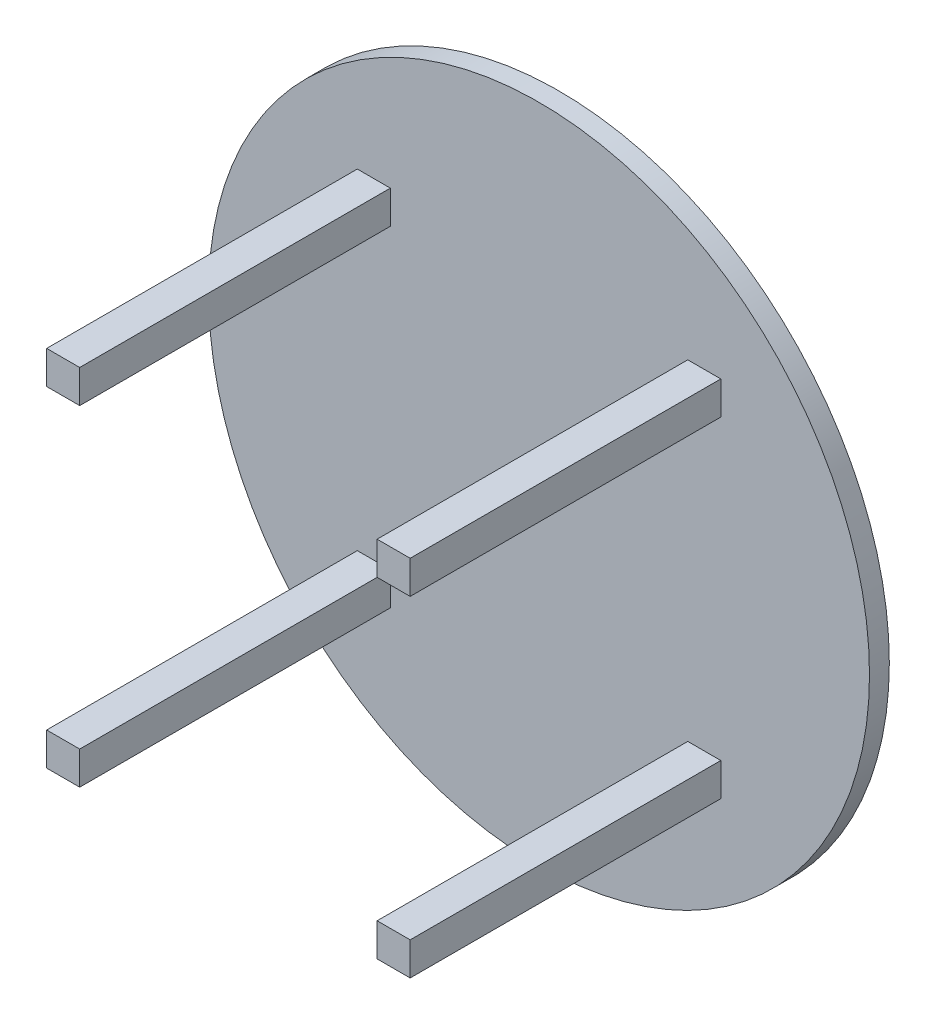
ISO-10303-21;
HEADER;
FILE_DESCRIPTION(('STEP AP214'),'2;1');
FILE_NAME('part.step','',(''),(''),'','','');
FILE_SCHEMA(('AUTOMOTIVE_DESIGN { 1 0 10303 214 1 1 1 1 }'));
ENDSEC;
DATA;
#1=APPLICATION_CONTEXT('core data for automotive mechanical design processes');
#2=APPLICATION_PROTOCOL_DEFINITION('international standard','automotive_design',2000,#1);
#3=PRODUCT_CONTEXT('',#1,'mechanical');
#4=PRODUCT('Part','Part','',(#3));
#5=PRODUCT_RELATED_PRODUCT_CATEGORY('part','',(#4));
#6=PRODUCT_DEFINITION_FORMATION('','',#4);
#7=PRODUCT_DEFINITION_CONTEXT('part definition',#1,'design');
#8=PRODUCT_DEFINITION('design','',#6,#7);
#9=PRODUCT_DEFINITION_SHAPE('','',#8);
#10=(LENGTH_UNIT() NAMED_UNIT(*) SI_UNIT(.MILLI.,.METRE.));
#11=(NAMED_UNIT(*) PLANE_ANGLE_UNIT() SI_UNIT($,.RADIAN.));
#12=(NAMED_UNIT(*) SI_UNIT($,.STERADIAN.) SOLID_ANGLE_UNIT());
#13=UNCERTAINTY_MEASURE_WITH_UNIT(LENGTH_MEASURE(1.E-05),#10,'distance_accuracy_value','');
#14=(GEOMETRIC_REPRESENTATION_CONTEXT(3) GLOBAL_UNCERTAINTY_ASSIGNED_CONTEXT((#13)) GLOBAL_UNIT_ASSIGNED_CONTEXT((#10,
#11,#12)) REPRESENTATION_CONTEXT('',''));
#15=CARTESIAN_POINT('',(0.,0.,0.));
#16=DIRECTION('',(0.,0.,1.));
#17=DIRECTION('',(1.,0.,0.));
#18=AXIS2_PLACEMENT_3D('',#15,#16,#17);
#19=CARTESIAN_POINT('',(0.,0.,30.));
#20=DIRECTION('',(0.,0.,1.));
#21=DIRECTION('',(1.,0.,0.));
#22=AXIS2_PLACEMENT_3D('',#19,#20,#21);
#23=PLANE('',#22);
#24=CARTESIAN_POINT('',(0.,0.,30.));
#25=DIRECTION('',(0.,0.,1.));
#26=DIRECTION('',(1.,0.,0.));
#27=AXIS2_PLACEMENT_3D('',#24,#25,#26);
#28=CIRCLE('',#27,500.);
#29=CARTESIAN_POINT('',(500.,0.,30.));
#30=VERTEX_POINT('',#29);
#31=EDGE_CURVE('E11',#30,#30,#28,.T.);
#32=ORIENTED_EDGE('',*,*,#31,.T.);
#33=EDGE_LOOP('',(#32));
#34=FACE_BOUND('',#33,.T.);
#35=DIRECTION('',(1.,0.,0.));
#36=VECTOR('',#35,1.);
#37=CARTESIAN_POINT('',(0.,275.,30.));
#38=LINE('',#37,#36);
#39=CARTESIAN_POINT('',(225.,275.,30.));
#40=VERTEX_POINT('',#39);
#41=CARTESIAN_POINT('',(275.,275.,30.));
#42=VERTEX_POINT('',#41);
#43=EDGE_CURVE('E280',#40,#42,#38,.T.);
#44=ORIENTED_EDGE('',*,*,#43,.T.);
#45=DIRECTION('',(0.,-1.,0.));
#46=VECTOR('',#45,1.);
#47=CARTESIAN_POINT('',(275.,0.,30.));
#48=LINE('',#47,#46);
#49=CARTESIAN_POINT('',(275.,225.,30.));
#50=VERTEX_POINT('',#49);
#51=EDGE_CURVE('E283',#42,#50,#48,.T.);
#52=ORIENTED_EDGE('',*,*,#51,.T.);
#53=DIRECTION('',(-1.,0.,0.));
#54=VECTOR('',#53,1.);
#55=CARTESIAN_POINT('',(0.,225.,30.));
#56=LINE('',#55,#54);
#57=CARTESIAN_POINT('',(225.,225.,30.));
#58=VERTEX_POINT('',#57);
#59=EDGE_CURVE('E274',#50,#58,#56,.T.);
#60=ORIENTED_EDGE('',*,*,#59,.T.);
#61=DIRECTION('',(0.,1.,0.));
#62=VECTOR('',#61,1.);
#63=CARTESIAN_POINT('',(225.,0.,30.));
#64=LINE('',#63,#62);
#65=EDGE_CURVE('E277',#58,#40,#64,.T.);
#66=ORIENTED_EDGE('',*,*,#65,.T.);
#67=EDGE_LOOP('',(#44,#52,#60,#66));
#68=FACE_BOUND('',#67,.T.);
#69=DIRECTION('',(1.,0.,0.));
#70=VECTOR('',#69,1.);
#71=CARTESIAN_POINT('',(0.,-225.,30.));
#72=LINE('',#71,#70);
#73=CARTESIAN_POINT('',(225.,-225.,30.));
#74=VERTEX_POINT('',#73);
#75=CARTESIAN_POINT('',(275.,-225.,30.));
#76=VERTEX_POINT('',#75);
#77=EDGE_CURVE('E248',#74,#76,#72,.T.);
#78=ORIENTED_EDGE('',*,*,#77,.T.);
#79=DIRECTION('',(0.,-1.,0.));
#80=VECTOR('',#79,1.);
#81=CARTESIAN_POINT('',(275.,0.,30.));
#82=LINE('',#81,#80);
#83=CARTESIAN_POINT('',(275.,-275.,30.));
#84=VERTEX_POINT('',#83);
#85=EDGE_CURVE('E251',#76,#84,#82,.T.);
#86=ORIENTED_EDGE('',*,*,#85,.T.);
#87=DIRECTION('',(-1.,0.,0.));
#88=VECTOR('',#87,1.);
#89=CARTESIAN_POINT('',(0.,-275.,30.));
#90=LINE('',#89,#88);
#91=CARTESIAN_POINT('',(225.,-275.,30.));
#92=VERTEX_POINT('',#91);
#93=EDGE_CURVE('E242',#84,#92,#90,.T.);
#94=ORIENTED_EDGE('',*,*,#93,.T.);
#95=DIRECTION('',(0.,1.,0.));
#96=VECTOR('',#95,1.);
#97=CARTESIAN_POINT('',(225.,0.,30.));
#98=LINE('',#97,#96);
#99=EDGE_CURVE('E245',#92,#74,#98,.T.);
#100=ORIENTED_EDGE('',*,*,#99,.T.);
#101=EDGE_LOOP('',(#78,#86,#94,#100));
#102=FACE_BOUND('',#101,.T.);
#103=DIRECTION('',(1.,0.,0.));
#104=VECTOR('',#103,1.);
#105=CARTESIAN_POINT('',(0.,275.,30.));
#106=LINE('',#105,#104);
#107=CARTESIAN_POINT('',(-275.,275.,30.));
#108=VERTEX_POINT('',#107);
#109=CARTESIAN_POINT('',(-225.,275.,30.));
#110=VERTEX_POINT('',#109);
#111=EDGE_CURVE('E216',#108,#110,#106,.T.);
#112=ORIENTED_EDGE('',*,*,#111,.T.);
#113=DIRECTION('',(0.,-1.,0.));
#114=VECTOR('',#113,1.);
#115=CARTESIAN_POINT('',(-225.,0.,30.));
#116=LINE('',#115,#114);
#117=CARTESIAN_POINT('',(-225.,225.,30.));
#118=VERTEX_POINT('',#117);
#119=EDGE_CURVE('E219',#110,#118,#116,.T.);
#120=ORIENTED_EDGE('',*,*,#119,.T.);
#121=DIRECTION('',(-1.,0.,0.));
#122=VECTOR('',#121,1.);
#123=CARTESIAN_POINT('',(0.,225.,30.));
#124=LINE('',#123,#122);
#125=CARTESIAN_POINT('',(-275.,225.,30.));
#126=VERTEX_POINT('',#125);
#127=EDGE_CURVE('E210',#118,#126,#124,.T.);
#128=ORIENTED_EDGE('',*,*,#127,.T.);
#129=DIRECTION('',(0.,1.,0.));
#130=VECTOR('',#129,1.);
#131=CARTESIAN_POINT('',(-275.,0.,30.));
#132=LINE('',#131,#130);
#133=EDGE_CURVE('E213',#126,#108,#132,.T.);
#134=ORIENTED_EDGE('',*,*,#133,.T.);
#135=EDGE_LOOP('',(#112,#120,#128,#134));
#136=FACE_BOUND('',#135,.T.);
#137=DIRECTION('',(1.,0.,0.));
#138=VECTOR('',#137,1.);
#139=CARTESIAN_POINT('',(0.,-225.,30.));
#140=LINE('',#139,#138);
#141=CARTESIAN_POINT('',(-275.,-225.,30.));
#142=VERTEX_POINT('',#141);
#143=CARTESIAN_POINT('',(-225.,-225.,30.));
#144=VERTEX_POINT('',#143);
#145=EDGE_CURVE('E188',#142,#144,#140,.T.);
#146=ORIENTED_EDGE('',*,*,#145,.T.);
#147=DIRECTION('',(0.,-1.,0.));
#148=VECTOR('',#147,1.);
#149=CARTESIAN_POINT('',(-225.,0.,30.));
#150=LINE('',#149,#148);
#151=CARTESIAN_POINT('',(-225.,-275.,30.));
#152=VERTEX_POINT('',#151);
#153=EDGE_CURVE('E177',#144,#152,#150,.T.);
#154=ORIENTED_EDGE('',*,*,#153,.T.);
#155=DIRECTION('',(-1.,0.,0.));
#156=VECTOR('',#155,1.);
#157=CARTESIAN_POINT('',(0.,-275.,30.));
#158=LINE('',#157,#156);
#159=CARTESIAN_POINT('',(-275.,-275.,30.));
#160=VERTEX_POINT('',#159);
#161=EDGE_CURVE('E178',#152,#160,#158,.T.);
#162=ORIENTED_EDGE('',*,*,#161,.T.);
#163=DIRECTION('',(0.,1.,0.));
#164=VECTOR('',#163,1.);
#165=CARTESIAN_POINT('',(-275.,0.,30.));
#166=LINE('',#165,#164);
#167=EDGE_CURVE('E181',#160,#142,#166,.T.);
#168=ORIENTED_EDGE('',*,*,#167,.T.);
#169=EDGE_LOOP('',(#146,#154,#162,#168));
#170=FACE_BOUND('',#169,.T.);
#171=ADVANCED_FACE('F40',(#34,#68,#102,#136,#170),#23,.T.);
#172=CARTESIAN_POINT('',(0.,0.,30.));
#173=DIRECTION('',(0.,0.,-1.));
#174=DIRECTION('',(-1.,0.,0.));
#175=AXIS2_PLACEMENT_3D('',#172,#173,#174);
#176=CYLINDRICAL_SURFACE('',#175,500.);
#177=ORIENTED_EDGE('',*,*,#31,.F.);
#178=EDGE_LOOP('',(#177));
#179=FACE_BOUND('',#178,.T.);
#180=CARTESIAN_POINT('',(0.,0.,0.));
#181=DIRECTION('',(0.,0.,1.));
#182=DIRECTION('',(1.,0.,0.));
#183=AXIS2_PLACEMENT_3D('',#180,#181,#182);
#184=CIRCLE('',#183,500.);
#185=CARTESIAN_POINT('',(500.,0.,0.));
#186=VERTEX_POINT('',#185);
#187=EDGE_CURVE('E44',#186,#186,#184,.T.);
#188=ORIENTED_EDGE('',*,*,#187,.T.);
#189=EDGE_LOOP('',(#188));
#190=FACE_BOUND('',#189,.T.);
#191=ADVANCED_FACE('F42',(#179,#190),#176,.T.);
#192=CARTESIAN_POINT('',(0.,0.,0.));
#193=DIRECTION('',(0.,0.,1.));
#194=DIRECTION('',(1.,0.,0.));
#195=AXIS2_PLACEMENT_3D('',#192,#193,#194);
#196=PLANE('',#195);
#197=ORIENTED_EDGE('',*,*,#187,.F.);
#198=EDGE_LOOP('',(#197));
#199=FACE_BOUND('',#198,.T.);
#200=ADVANCED_FACE('F290',(#199),#196,.F.);
#201=CARTESIAN_POINT('',(275.,225.,500.));
#202=DIRECTION('',(-1.,0.,0.));
#203=DIRECTION('',(0.,0.,1.));
#204=AXIS2_PLACEMENT_3D('',#201,#202,#203);
#205=PLANE('',#204);
#206=ORIENTED_EDGE('',*,*,#51,.F.);
#207=DIRECTION('',(0.,0.,-1.));
#208=VECTOR('',#207,1.);
#209=CARTESIAN_POINT('',(275.,275.,500.));
#210=LINE('',#209,#208);
#211=CARTESIAN_POINT('',(275.,275.,500.));
#212=VERTEX_POINT('',#211);
#213=EDGE_CURVE('E271',#212,#42,#210,.T.);
#214=ORIENTED_EDGE('',*,*,#213,.F.);
#215=DIRECTION('',(0.,1.,0.));
#216=VECTOR('',#215,1.);
#217=CARTESIAN_POINT('',(275.,225.,500.));
#218=LINE('',#217,#216);
#219=CARTESIAN_POINT('',(275.,225.,500.));
#220=VERTEX_POINT('',#219);
#221=EDGE_CURVE('E254',#220,#212,#218,.T.);
#222=ORIENTED_EDGE('',*,*,#221,.F.);
#223=DIRECTION('',(0.,0.,-1.));
#224=VECTOR('',#223,1.);
#225=CARTESIAN_POINT('',(275.,225.,500.));
#226=LINE('',#225,#224);
#227=EDGE_CURVE('E263',#220,#50,#226,.T.);
#228=ORIENTED_EDGE('',*,*,#227,.T.);
#229=EDGE_LOOP('',(#206,#214,#222,#228));
#230=FACE_BOUND('',#229,.T.);
#231=ADVANCED_FACE('F292',(#230),#205,.F.);
#232=CARTESIAN_POINT('',(225.,275.,500.));
#233=DIRECTION('',(0.,-1.,0.));
#234=DIRECTION('',(0.,0.,-1.));
#235=AXIS2_PLACEMENT_3D('',#232,#233,#234);
#236=PLANE('',#235);
#237=ORIENTED_EDGE('',*,*,#43,.F.);
#238=DIRECTION('',(0.,0.,-1.));
#239=VECTOR('',#238,1.);
#240=CARTESIAN_POINT('',(225.,275.,500.));
#241=LINE('',#240,#239);
#242=CARTESIAN_POINT('',(225.,275.,500.));
#243=VERTEX_POINT('',#242);
#244=EDGE_CURVE('E268',#243,#40,#241,.T.);
#245=ORIENTED_EDGE('',*,*,#244,.F.);
#246=DIRECTION('',(-1.,0.,0.));
#247=VECTOR('',#246,1.);
#248=CARTESIAN_POINT('',(225.,275.,500.));
#249=LINE('',#248,#247);
#250=EDGE_CURVE('E257',#212,#243,#249,.T.);
#251=ORIENTED_EDGE('',*,*,#250,.F.);
#252=ORIENTED_EDGE('',*,*,#213,.T.);
#253=EDGE_LOOP('',(#237,#245,#251,#252));
#254=FACE_BOUND('',#253,.T.);
#255=ADVANCED_FACE('F298',(#254),#236,.F.);
#256=CARTESIAN_POINT('',(225.,225.,500.));
#257=DIRECTION('',(1.,0.,0.));
#258=DIRECTION('',(0.,0.,-1.));
#259=AXIS2_PLACEMENT_3D('',#256,#257,#258);
#260=PLANE('',#259);
#261=ORIENTED_EDGE('',*,*,#65,.F.);
#262=DIRECTION('',(0.,0.,-1.));
#263=VECTOR('',#262,1.);
#264=CARTESIAN_POINT('',(225.,225.,500.));
#265=LINE('',#264,#263);
#266=CARTESIAN_POINT('',(225.,225.,500.));
#267=VERTEX_POINT('',#266);
#268=EDGE_CURVE('E266',#267,#58,#265,.T.);
#269=ORIENTED_EDGE('',*,*,#268,.F.);
#270=DIRECTION('',(0.,-1.,0.));
#271=VECTOR('',#270,1.);
#272=CARTESIAN_POINT('',(225.,225.,500.));
#273=LINE('',#272,#271);
#274=EDGE_CURVE('E259',#243,#267,#273,.T.);
#275=ORIENTED_EDGE('',*,*,#274,.F.);
#276=ORIENTED_EDGE('',*,*,#244,.T.);
#277=EDGE_LOOP('',(#261,#269,#275,#276));
#278=FACE_BOUND('',#277,.T.);
#279=ADVANCED_FACE('F311',(#278),#260,.F.);
#280=CARTESIAN_POINT('',(225.,225.,500.));
#281=DIRECTION('',(0.,1.,0.));
#282=DIRECTION('',(0.,0.,1.));
#283=AXIS2_PLACEMENT_3D('',#280,#281,#282);
#284=PLANE('',#283);
#285=ORIENTED_EDGE('',*,*,#59,.F.);
#286=ORIENTED_EDGE('',*,*,#227,.F.);
#287=DIRECTION('',(1.,0.,0.));
#288=VECTOR('',#287,1.);
#289=CARTESIAN_POINT('',(225.,225.,500.));
#290=LINE('',#289,#288);
#291=EDGE_CURVE('E261',#267,#220,#290,.T.);
#292=ORIENTED_EDGE('',*,*,#291,.F.);
#293=ORIENTED_EDGE('',*,*,#268,.T.);
#294=EDGE_LOOP('',(#285,#286,#292,#293));
#295=FACE_BOUND('',#294,.T.);
#296=ADVANCED_FACE('F315',(#295),#284,.F.);
#297=CARTESIAN_POINT('',(0.,0.,500.));
#298=DIRECTION('',(0.,0.,-1.));
#299=DIRECTION('',(-1.,0.,0.));
#300=AXIS2_PLACEMENT_3D('',#297,#298,#299);
#301=PLANE('',#300);
#302=ORIENTED_EDGE('',*,*,#221,.T.);
#303=ORIENTED_EDGE('',*,*,#250,.T.);
#304=ORIENTED_EDGE('',*,*,#274,.T.);
#305=ORIENTED_EDGE('',*,*,#291,.T.);
#306=EDGE_LOOP('',(#302,#303,#304,#305));
#307=FACE_BOUND('',#306,.T.);
#308=ADVANCED_FACE('F319',(#307),#301,.F.);
#309=CARTESIAN_POINT('',(275.,-275.,500.));
#310=DIRECTION('',(-1.,0.,0.));
#311=DIRECTION('',(0.,0.,1.));
#312=AXIS2_PLACEMENT_3D('',#309,#310,#311);
#313=PLANE('',#312);
#314=ORIENTED_EDGE('',*,*,#85,.F.);
#315=DIRECTION('',(0.,0.,-1.));
#316=VECTOR('',#315,1.);
#317=CARTESIAN_POINT('',(275.,-225.,500.));
#318=LINE('',#317,#316);
#319=CARTESIAN_POINT('',(275.,-225.,500.));
#320=VERTEX_POINT('',#319);
#321=EDGE_CURVE('E239',#320,#76,#318,.T.);
#322=ORIENTED_EDGE('',*,*,#321,.F.);
#323=DIRECTION('',(0.,1.,0.));
#324=VECTOR('',#323,1.);
#325=CARTESIAN_POINT('',(275.,-275.,500.));
#326=LINE('',#325,#324);
#327=CARTESIAN_POINT('',(275.,-275.,500.));
#328=VERTEX_POINT('',#327);
#329=EDGE_CURVE('E222',#328,#320,#326,.T.);
#330=ORIENTED_EDGE('',*,*,#329,.F.);
#331=DIRECTION('',(0.,0.,-1.));
#332=VECTOR('',#331,1.);
#333=CARTESIAN_POINT('',(275.,-275.,500.));
#334=LINE('',#333,#332);
#335=EDGE_CURVE('E231',#328,#84,#334,.T.);
#336=ORIENTED_EDGE('',*,*,#335,.T.);
#337=EDGE_LOOP('',(#314,#322,#330,#336));
#338=FACE_BOUND('',#337,.T.);
#339=ADVANCED_FACE('F323',(#338),#313,.F.);
#340=CARTESIAN_POINT('',(225.,-225.,500.));
#341=DIRECTION('',(0.,-1.,0.));
#342=DIRECTION('',(0.,0.,-1.));
#343=AXIS2_PLACEMENT_3D('',#340,#341,#342);
#344=PLANE('',#343);
#345=ORIENTED_EDGE('',*,*,#77,.F.);
#346=DIRECTION('',(0.,0.,-1.));
#347=VECTOR('',#346,1.);
#348=CARTESIAN_POINT('',(225.,-225.,500.));
#349=LINE('',#348,#347);
#350=CARTESIAN_POINT('',(225.,-225.,500.));
#351=VERTEX_POINT('',#350);
#352=EDGE_CURVE('E236',#351,#74,#349,.T.);
#353=ORIENTED_EDGE('',*,*,#352,.F.);
#354=DIRECTION('',(-1.,0.,0.));
#355=VECTOR('',#354,1.);
#356=CARTESIAN_POINT('',(225.,-225.,500.));
#357=LINE('',#356,#355);
#358=EDGE_CURVE('E225',#320,#351,#357,.T.);
#359=ORIENTED_EDGE('',*,*,#358,.F.);
#360=ORIENTED_EDGE('',*,*,#321,.T.);
#361=EDGE_LOOP('',(#345,#353,#359,#360));
#362=FACE_BOUND('',#361,.T.);
#363=ADVANCED_FACE('F327',(#362),#344,.F.);
#364=CARTESIAN_POINT('',(225.,-275.,500.));
#365=DIRECTION('',(1.,0.,0.));
#366=DIRECTION('',(0.,0.,-1.));
#367=AXIS2_PLACEMENT_3D('',#364,#365,#366);
#368=PLANE('',#367);
#369=ORIENTED_EDGE('',*,*,#99,.F.);
#370=DIRECTION('',(0.,0.,-1.));
#371=VECTOR('',#370,1.);
#372=CARTESIAN_POINT('',(225.,-275.,500.));
#373=LINE('',#372,#371);
#374=CARTESIAN_POINT('',(225.,-275.,500.));
#375=VERTEX_POINT('',#374);
#376=EDGE_CURVE('E234',#375,#92,#373,.T.);
#377=ORIENTED_EDGE('',*,*,#376,.F.);
#378=DIRECTION('',(0.,-1.,0.));
#379=VECTOR('',#378,1.);
#380=CARTESIAN_POINT('',(225.,-275.,500.));
#381=LINE('',#380,#379);
#382=EDGE_CURVE('E227',#351,#375,#381,.T.);
#383=ORIENTED_EDGE('',*,*,#382,.F.);
#384=ORIENTED_EDGE('',*,*,#352,.T.);
#385=EDGE_LOOP('',(#369,#377,#383,#384));
#386=FACE_BOUND('',#385,.T.);
#387=ADVANCED_FACE('F331',(#386),#368,.F.);
#388=CARTESIAN_POINT('',(225.,-275.,500.));
#389=DIRECTION('',(0.,1.,0.));
#390=DIRECTION('',(0.,0.,1.));
#391=AXIS2_PLACEMENT_3D('',#388,#389,#390);
#392=PLANE('',#391);
#393=ORIENTED_EDGE('',*,*,#93,.F.);
#394=ORIENTED_EDGE('',*,*,#335,.F.);
#395=DIRECTION('',(1.,0.,0.));
#396=VECTOR('',#395,1.);
#397=CARTESIAN_POINT('',(225.,-275.,500.));
#398=LINE('',#397,#396);
#399=EDGE_CURVE('E229',#375,#328,#398,.T.);
#400=ORIENTED_EDGE('',*,*,#399,.F.);
#401=ORIENTED_EDGE('',*,*,#376,.T.);
#402=EDGE_LOOP('',(#393,#394,#400,#401));
#403=FACE_BOUND('',#402,.T.);
#404=ADVANCED_FACE('F335',(#403),#392,.F.);
#405=CARTESIAN_POINT('',(0.,0.,500.));
#406=DIRECTION('',(0.,0.,-1.));
#407=DIRECTION('',(-1.,0.,0.));
#408=AXIS2_PLACEMENT_3D('',#405,#406,#407);
#409=PLANE('',#408);
#410=ORIENTED_EDGE('',*,*,#329,.T.);
#411=ORIENTED_EDGE('',*,*,#358,.T.);
#412=ORIENTED_EDGE('',*,*,#382,.T.);
#413=ORIENTED_EDGE('',*,*,#399,.T.);
#414=EDGE_LOOP('',(#410,#411,#412,#413));
#415=FACE_BOUND('',#414,.T.);
#416=ADVANCED_FACE('F339',(#415),#409,.F.);
#417=CARTESIAN_POINT('',(-225.,225.,500.));
#418=DIRECTION('',(-1.,0.,0.));
#419=DIRECTION('',(0.,0.,1.));
#420=AXIS2_PLACEMENT_3D('',#417,#418,#419);
#421=PLANE('',#420);
#422=ORIENTED_EDGE('',*,*,#119,.F.);
#423=DIRECTION('',(0.,0.,-1.));
#424=VECTOR('',#423,1.);
#425=CARTESIAN_POINT('',(-225.,275.,500.));
#426=LINE('',#425,#424);
#427=CARTESIAN_POINT('',(-225.,275.,500.));
#428=VERTEX_POINT('',#427);
#429=EDGE_CURVE('E207',#428,#110,#426,.T.);
#430=ORIENTED_EDGE('',*,*,#429,.F.);
#431=DIRECTION('',(0.,1.,0.));
#432=VECTOR('',#431,1.);
#433=CARTESIAN_POINT('',(-225.,225.,500.));
#434=LINE('',#433,#432);
#435=CARTESIAN_POINT('',(-225.,225.,500.));
#436=VERTEX_POINT('',#435);
#437=EDGE_CURVE('E191',#436,#428,#434,.T.);
#438=ORIENTED_EDGE('',*,*,#437,.F.);
#439=DIRECTION('',(0.,0.,-1.));
#440=VECTOR('',#439,1.);
#441=CARTESIAN_POINT('',(-225.,225.,500.));
#442=LINE('',#441,#440);
#443=EDGE_CURVE('E200',#436,#118,#442,.T.);
#444=ORIENTED_EDGE('',*,*,#443,.T.);
#445=EDGE_LOOP('',(#422,#430,#438,#444));
#446=FACE_BOUND('',#445,.T.);
#447=ADVANCED_FACE('F343',(#446),#421,.F.);
#448=CARTESIAN_POINT('',(-275.,275.,500.));
#449=DIRECTION('',(0.,-1.,0.));
#450=DIRECTION('',(0.,0.,-1.));
#451=AXIS2_PLACEMENT_3D('',#448,#449,#450);
#452=PLANE('',#451);
#453=ORIENTED_EDGE('',*,*,#111,.F.);
#454=DIRECTION('',(0.,0.,-1.));
#455=VECTOR('',#454,1.);
#456=CARTESIAN_POINT('',(-275.,275.,500.));
#457=LINE('',#456,#455);
#458=CARTESIAN_POINT('',(-275.,275.,500.));
#459=VERTEX_POINT('',#458);
#460=EDGE_CURVE('E204',#459,#108,#457,.T.);
#461=ORIENTED_EDGE('',*,*,#460,.F.);
#462=DIRECTION('',(-1.,0.,0.));
#463=VECTOR('',#462,1.);
#464=CARTESIAN_POINT('',(-275.,275.,500.));
#465=LINE('',#464,#463);
#466=EDGE_CURVE('E194',#428,#459,#465,.T.);
#467=ORIENTED_EDGE('',*,*,#466,.F.);
#468=ORIENTED_EDGE('',*,*,#429,.T.);
#469=EDGE_LOOP('',(#453,#461,#467,#468));
#470=FACE_BOUND('',#469,.T.);
#471=ADVANCED_FACE('F347',(#470),#452,.F.);
#472=CARTESIAN_POINT('',(-275.,225.,500.));
#473=DIRECTION('',(1.,0.,0.));
#474=DIRECTION('',(0.,0.,-1.));
#475=AXIS2_PLACEMENT_3D('',#472,#473,#474);
#476=PLANE('',#475);
#477=ORIENTED_EDGE('',*,*,#133,.F.);
#478=DIRECTION('',(0.,0.,-1.));
#479=VECTOR('',#478,1.);
#480=CARTESIAN_POINT('',(-275.,225.,500.));
#481=LINE('',#480,#479);
#482=CARTESIAN_POINT('',(-275.,225.,500.));
#483=VERTEX_POINT('',#482);
#484=EDGE_CURVE('E63',#483,#126,#481,.T.);
#485=ORIENTED_EDGE('',*,*,#484,.F.);
#486=DIRECTION('',(0.,-1.,0.));
#487=VECTOR('',#486,1.);
#488=CARTESIAN_POINT('',(-275.,225.,500.));
#489=LINE('',#488,#487);
#490=EDGE_CURVE('E196',#459,#483,#489,.T.);
#491=ORIENTED_EDGE('',*,*,#490,.F.);
#492=ORIENTED_EDGE('',*,*,#460,.T.);
#493=EDGE_LOOP('',(#477,#485,#491,#492));
#494=FACE_BOUND('',#493,.T.);
#495=ADVANCED_FACE('F351',(#494),#476,.F.);
#496=CARTESIAN_POINT('',(-275.,225.,500.));
#497=DIRECTION('',(0.,1.,0.));
#498=DIRECTION('',(0.,0.,1.));
#499=AXIS2_PLACEMENT_3D('',#496,#497,#498);
#500=PLANE('',#499);
#501=ORIENTED_EDGE('',*,*,#127,.F.);
#502=ORIENTED_EDGE('',*,*,#443,.F.);
#503=DIRECTION('',(1.,0.,0.));
#504=VECTOR('',#503,1.);
#505=CARTESIAN_POINT('',(-275.,225.,500.));
#506=LINE('',#505,#504);
#507=EDGE_CURVE('E198',#483,#436,#506,.T.);
#508=ORIENTED_EDGE('',*,*,#507,.F.);
#509=ORIENTED_EDGE('',*,*,#484,.T.);
#510=EDGE_LOOP('',(#501,#502,#508,#509));
#511=FACE_BOUND('',#510,.T.);
#512=ADVANCED_FACE('F355',(#511),#500,.F.);
#513=CARTESIAN_POINT('',(0.,0.,500.));
#514=DIRECTION('',(0.,0.,-1.));
#515=DIRECTION('',(-1.,0.,0.));
#516=AXIS2_PLACEMENT_3D('',#513,#514,#515);
#517=PLANE('',#516);
#518=ORIENTED_EDGE('',*,*,#437,.T.);
#519=ORIENTED_EDGE('',*,*,#466,.T.);
#520=ORIENTED_EDGE('',*,*,#490,.T.);
#521=ORIENTED_EDGE('',*,*,#507,.T.);
#522=EDGE_LOOP('',(#518,#519,#520,#521));
#523=FACE_BOUND('',#522,.T.);
#524=ADVANCED_FACE('F359',(#523),#517,.F.);
#525=CARTESIAN_POINT('',(-225.,-275.,500.));
#526=DIRECTION('',(-1.,0.,0.));
#527=DIRECTION('',(0.,0.,1.));
#528=AXIS2_PLACEMENT_3D('',#525,#526,#527);
#529=PLANE('',#528);
#530=ORIENTED_EDGE('',*,*,#153,.F.);
#531=DIRECTION('',(0.,0.,-1.));
#532=VECTOR('',#531,1.);
#533=CARTESIAN_POINT('',(-225.,-225.,500.));
#534=LINE('',#533,#532);
#535=CARTESIAN_POINT('',(-225.,-225.,500.));
#536=VERTEX_POINT('',#535);
#537=EDGE_CURVE('E159',#536,#144,#534,.T.);
#538=ORIENTED_EDGE('',*,*,#537,.F.);
#539=DIRECTION('',(0.,1.,0.));
#540=VECTOR('',#539,1.);
#541=CARTESIAN_POINT('',(-225.,-275.,500.));
#542=LINE('',#541,#540);
#543=CARTESIAN_POINT('',(-225.,-275.,500.));
#544=VERTEX_POINT('',#543);
#545=EDGE_CURVE('E166',#544,#536,#542,.T.);
#546=ORIENTED_EDGE('',*,*,#545,.F.);
#547=DIRECTION('',(0.,0.,-1.));
#548=VECTOR('',#547,1.);
#549=CARTESIAN_POINT('',(-225.,-275.,500.));
#550=LINE('',#549,#548);
#551=EDGE_CURVE('E507',#544,#152,#550,.T.);
#552=ORIENTED_EDGE('',*,*,#551,.T.);
#553=EDGE_LOOP('',(#530,#538,#546,#552));
#554=FACE_BOUND('',#553,.T.);
#555=ADVANCED_FACE('F175',(#554),#529,.F.);
#556=CARTESIAN_POINT('',(-275.,-225.,500.));
#557=DIRECTION('',(0.,-1.,0.));
#558=DIRECTION('',(0.,0.,-1.));
#559=AXIS2_PLACEMENT_3D('',#556,#557,#558);
#560=PLANE('',#559);
#561=ORIENTED_EDGE('',*,*,#145,.F.);
#562=DIRECTION('',(0.,0.,-1.));
#563=VECTOR('',#562,1.);
#564=CARTESIAN_POINT('',(-275.,-225.,500.));
#565=LINE('',#564,#563);
#566=CARTESIAN_POINT('',(-275.,-225.,500.));
#567=VERTEX_POINT('',#566);
#568=EDGE_CURVE('E162',#567,#142,#565,.T.);
#569=ORIENTED_EDGE('',*,*,#568,.F.);
#570=DIRECTION('',(-1.,0.,0.));
#571=VECTOR('',#570,1.);
#572=CARTESIAN_POINT('',(-275.,-225.,500.));
#573=LINE('',#572,#571);
#574=EDGE_CURVE('E155',#536,#567,#573,.T.);
#575=ORIENTED_EDGE('',*,*,#574,.F.);
#576=ORIENTED_EDGE('',*,*,#537,.T.);
#577=EDGE_LOOP('',(#561,#569,#575,#576));
#578=FACE_BOUND('',#577,.T.);
#579=ADVANCED_FACE('F157',(#578),#560,.F.);
#580=CARTESIAN_POINT('',(-275.,-275.,500.));
#581=DIRECTION('',(1.,0.,0.));
#582=DIRECTION('',(0.,0.,-1.));
#583=AXIS2_PLACEMENT_3D('',#580,#581,#582);
#584=PLANE('',#583);
#585=ORIENTED_EDGE('',*,*,#167,.F.);
#586=DIRECTION('',(0.,0.,-1.));
#587=VECTOR('',#586,1.);
#588=CARTESIAN_POINT('',(-275.,-275.,500.));
#589=LINE('',#588,#587);
#590=CARTESIAN_POINT('',(-275.,-275.,500.));
#591=VERTEX_POINT('',#590);
#592=EDGE_CURVE('E55',#591,#160,#589,.T.);
#593=ORIENTED_EDGE('',*,*,#592,.F.);
#594=DIRECTION('',(0.,-1.,0.));
#595=VECTOR('',#594,1.);
#596=CARTESIAN_POINT('',(-275.,-275.,500.));
#597=LINE('',#596,#595);
#598=EDGE_CURVE('E165',#567,#591,#597,.T.);
#599=ORIENTED_EDGE('',*,*,#598,.F.);
#600=ORIENTED_EDGE('',*,*,#568,.T.);
#601=EDGE_LOOP('',(#585,#593,#599,#600));
#602=FACE_BOUND('',#601,.T.);
#603=ADVANCED_FACE('F365',(#602),#584,.F.);
#604=CARTESIAN_POINT('',(-275.,-275.,500.));
#605=DIRECTION('',(0.,1.,0.));
#606=DIRECTION('',(0.,0.,1.));
#607=AXIS2_PLACEMENT_3D('',#604,#605,#606);
#608=PLANE('',#607);
#609=ORIENTED_EDGE('',*,*,#161,.F.);
#610=ORIENTED_EDGE('',*,*,#551,.F.);
#611=DIRECTION('',(1.,0.,0.));
#612=VECTOR('',#611,1.);
#613=CARTESIAN_POINT('',(-275.,-275.,500.));
#614=LINE('',#613,#612);
#615=EDGE_CURVE('E170',#591,#544,#614,.T.);
#616=ORIENTED_EDGE('',*,*,#615,.F.);
#617=ORIENTED_EDGE('',*,*,#592,.T.);
#618=EDGE_LOOP('',(#609,#610,#616,#617));
#619=FACE_BOUND('',#618,.T.);
#620=ADVANCED_FACE('F368',(#619),#608,.F.);
#621=CARTESIAN_POINT('',(0.,0.,500.));
#622=DIRECTION('',(0.,0.,-1.));
#623=DIRECTION('',(-1.,0.,0.));
#624=AXIS2_PLACEMENT_3D('',#621,#622,#623);
#625=PLANE('',#624);
#626=ORIENTED_EDGE('',*,*,#545,.T.);
#627=ORIENTED_EDGE('',*,*,#574,.T.);
#628=ORIENTED_EDGE('',*,*,#598,.T.);
#629=ORIENTED_EDGE('',*,*,#615,.T.);
#630=EDGE_LOOP('',(#626,#627,#628,#629));
#631=FACE_BOUND('',#630,.T.);
#632=ADVANCED_FACE('F169',(#631),#625,.F.);
#633=CLOSED_SHELL('',(#171,#191,#200,#231,#255,#279,#296,#308,#339,#363,#387,#404,#416,#447,
#471,#495,#512,#524,#555,#579,#603,#620,#632));
#634=MANIFOLD_SOLID_BREP('B2',#633);
#635=ADVANCED_BREP_SHAPE_REPRESENTATION('',(#18,#634),#14);
#636=SHAPE_DEFINITION_REPRESENTATION(#9,#635);
ENDSEC;
END-ISO-10303-21;
